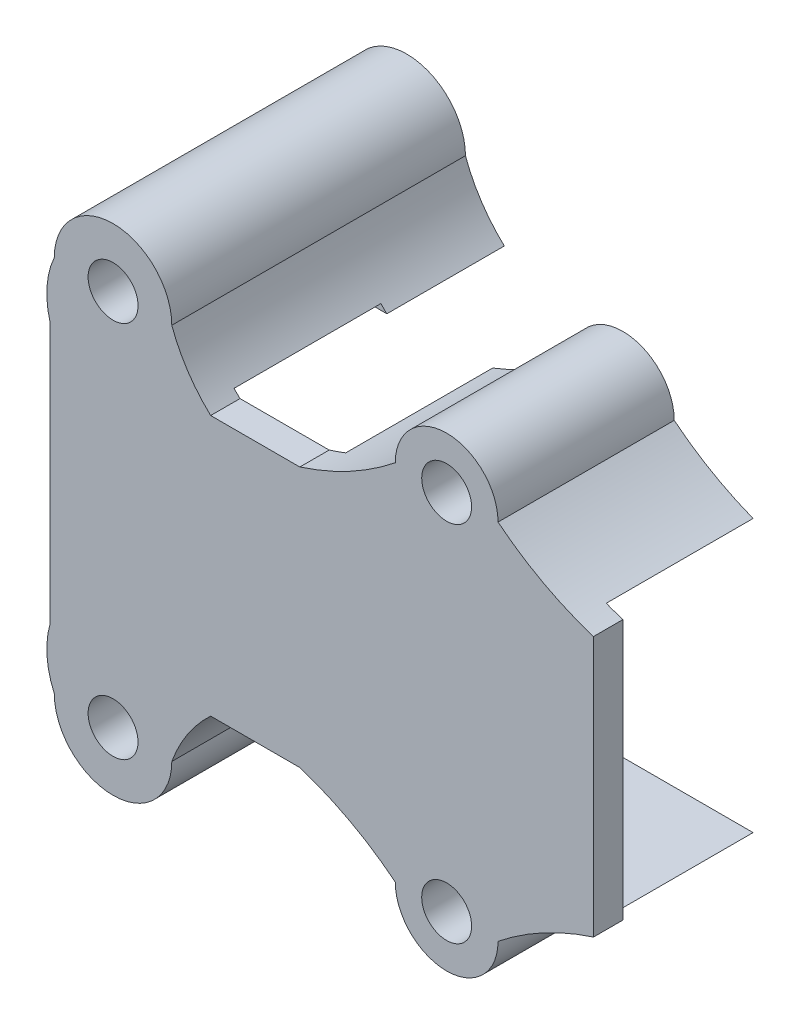
ISO-10303-21;
HEADER;
FILE_DESCRIPTION(('STEP AP214'),'2;1');
FILE_NAME('part.step','',(''),(''),'','','');
FILE_SCHEMA(('AUTOMOTIVE_DESIGN { 1 0 10303 214 1 1 1 1 }'));
ENDSEC;
DATA;
#1=APPLICATION_CONTEXT('core data for automotive mechanical design processes');
#2=APPLICATION_PROTOCOL_DEFINITION('international standard','automotive_design',2000,#1);
#3=PRODUCT_CONTEXT('',#1,'mechanical');
#4=PRODUCT('Part','Part','',(#3));
#5=PRODUCT_RELATED_PRODUCT_CATEGORY('part','',(#4));
#6=PRODUCT_DEFINITION_FORMATION('','',#4);
#7=PRODUCT_DEFINITION_CONTEXT('part definition',#1,'design');
#8=PRODUCT_DEFINITION('design','',#6,#7);
#9=PRODUCT_DEFINITION_SHAPE('','',#8);
#10=(LENGTH_UNIT() NAMED_UNIT(*) SI_UNIT(.MILLI.,.METRE.));
#11=(NAMED_UNIT(*) PLANE_ANGLE_UNIT() SI_UNIT($,.RADIAN.));
#12=(NAMED_UNIT(*) SI_UNIT($,.STERADIAN.) SOLID_ANGLE_UNIT());
#13=UNCERTAINTY_MEASURE_WITH_UNIT(LENGTH_MEASURE(1.E-05),#10,'distance_accuracy_value','');
#14=(GEOMETRIC_REPRESENTATION_CONTEXT(3) GLOBAL_UNCERTAINTY_ASSIGNED_CONTEXT((#13)) GLOBAL_UNIT_ASSIGNED_CONTEXT((#10,
#11,#12)) REPRESENTATION_CONTEXT('',''));
#15=CARTESIAN_POINT('',(0.,0.,0.));
#16=DIRECTION('',(0.,0.,1.));
#17=DIRECTION('',(1.,0.,0.));
#18=AXIS2_PLACEMENT_3D('',#15,#16,#17);
#19=CARTESIAN_POINT('',(78.7467848075669,16.0793875809967,2.));
#20=DIRECTION('',(0.,0.,-1.));
#21=DIRECTION('',(-1.,0.,0.));
#22=AXIS2_PLACEMENT_3D('',#19,#20,#21);
#23=CYLINDRICAL_SURFACE('',#22,10.1879694452596);
#24=CARTESIAN_POINT('',(78.7467848075669,16.0793875809967,0.));
#25=DIRECTION('',(0.,0.,-1.));
#26=DIRECTION('',(-1.,0.,0.));
#27=AXIS2_PLACEMENT_3D('',#24,#25,#26);
#28=CIRCLE('',#27,10.1879694452596);
#29=CARTESIAN_POINT('',(71.4070195583268,9.01379719493618,0.));
#30=VERTEX_POINT('',#29);
#31=CARTESIAN_POINT('',(71.8142757664545,8.61379719493618,0.));
#32=VERTEX_POINT('',#31);
#33=EDGE_CURVE('E460',#30,#32,#28,.F.);
#34=ORIENTED_EDGE('',*,*,#33,.F.);
#35=DIRECTION('',(0.,0.,-1.));
#36=VECTOR('',#35,1.);
#37=CARTESIAN_POINT('',(71.4070195583268,9.01379719493618,2.));
#38=LINE('',#37,#36);
#39=CARTESIAN_POINT('',(71.4070195583268,9.01379719493618,-10.));
#40=VERTEX_POINT('',#39);
#41=EDGE_CURVE('E488',#30,#40,#38,.T.);
#42=ORIENTED_EDGE('',*,*,#41,.T.);
#43=CARTESIAN_POINT('',(78.7467848075669,16.0793875809967,-10.));
#44=DIRECTION('',(0.,0.,-1.));
#45=DIRECTION('',(-1.,0.,0.));
#46=AXIS2_PLACEMENT_3D('',#43,#44,#45);
#47=CIRCLE('',#46,10.1879694452596);
#48=CARTESIAN_POINT('',(71.8142757664545,8.61379719493618,-10.));
#49=VERTEX_POINT('',#48);
#50=EDGE_CURVE('E575',#40,#49,#47,.F.);
#51=ORIENTED_EDGE('',*,*,#50,.T.);
#52=DIRECTION('',(0.,0.,1.));
#53=VECTOR('',#52,1.);
#54=CARTESIAN_POINT('',(71.8142757664545,8.61379719493618,-31.1896201004171));
#55=LINE('',#54,#53);
#56=CARTESIAN_POINT('',(71.8142757664545,8.61379719493618,-18.));
#57=VERTEX_POINT('',#56);
#58=EDGE_CURVE('E540',#57,#49,#55,.T.);
#59=ORIENTED_EDGE('',*,*,#58,.F.);
#60=CARTESIAN_POINT('',(78.7467848075669,16.0793875809967,-18.));
#61=DIRECTION('',(0.,0.,1.));
#62=DIRECTION('',(-1.,0.,0.));
#63=AXIS2_PLACEMENT_3D('',#60,#61,#62);
#64=CIRCLE('',#63,10.1879694452596);
#65=CARTESIAN_POINT('',(69.1663670351736,12.6137971949362,-18.));
#66=VERTEX_POINT('',#65);
#67=EDGE_CURVE('E520',#66,#57,#64,.T.);
#68=ORIENTED_EDGE('',*,*,#67,.F.);
#69=DIRECTION('',(0.,0.,-1.));
#70=VECTOR('',#69,1.);
#71=CARTESIAN_POINT('',(69.1663670351736,12.6137971949362,2.));
#72=LINE('',#71,#70);
#73=CARTESIAN_POINT('',(69.1663670351736,12.6137971949362,2.));
#74=VERTEX_POINT('',#73);
#75=EDGE_CURVE('E402',#74,#66,#72,.T.);
#76=ORIENTED_EDGE('',*,*,#75,.F.);
#77=CARTESIAN_POINT('',(78.7467848075669,16.0793875809967,2.));
#78=DIRECTION('',(0.,0.,-1.));
#79=DIRECTION('',(1.,0.,0.));
#80=AXIS2_PLACEMENT_3D('',#77,#78,#79);
#81=CIRCLE('',#80,10.1879694452596);
#82=CARTESIAN_POINT('',(71.8142757664545,8.61379719493618,2.));
#83=VERTEX_POINT('',#82);
#84=EDGE_CURVE('E313',#83,#74,#81,.T.);
#85=ORIENTED_EDGE('',*,*,#84,.F.);
#86=DIRECTION('',(0.,0.,-1.));
#87=VECTOR('',#86,1.);
#88=CARTESIAN_POINT('',(71.8142757664545,8.61379719493618,2.));
#89=LINE('',#88,#87);
#90=EDGE_CURVE('E405',#83,#32,#89,.T.);
#91=ORIENTED_EDGE('',*,*,#90,.T.);
#92=EDGE_LOOP('',(#34,#42,#51,#59,#68,#76,#85,#91));
#93=FACE_BOUND('',#92,.T.);
#94=ADVANCED_FACE('F39',(#93),#23,.F.);
#95=CARTESIAN_POINT('',(66.432044881579,10.2345085013512,2.));
#96=DIRECTION('',(0.,0.,-1.));
#97=DIRECTION('',(-1.,0.,0.));
#98=AXIS2_PLACEMENT_3D('',#95,#96,#97);
#99=CYLINDRICAL_SURFACE('',#98,5.77826772221092);
#100=CARTESIAN_POINT('',(66.432044881579,10.2345085013512,0.));
#101=DIRECTION('',(0.,0.,-1.));
#102=DIRECTION('',(-1.,0.,0.));
#103=AXIS2_PLACEMENT_3D('',#100,#101,#102);
#104=CIRCLE('',#103,5.77826772221092);
#105=CARTESIAN_POINT('',(60.8857242335454,8.61379719493618,0.));
#106=VERTEX_POINT('',#105);
#107=CARTESIAN_POINT('',(60.7841920350598,9.01379719493618,0.));
#108=VERTEX_POINT('',#107);
#109=EDGE_CURVE('E469',#106,#108,#104,.T.);
#110=ORIENTED_EDGE('',*,*,#109,.F.);
#111=DIRECTION('',(0.,0.,-1.));
#112=VECTOR('',#111,1.);
#113=CARTESIAN_POINT('',(60.8857242335454,8.61379719493618,2.));
#114=LINE('',#113,#112);
#115=CARTESIAN_POINT('',(60.8857242335454,8.61379719493618,2.));
#116=VERTEX_POINT('',#115);
#117=EDGE_CURVE('E395',#116,#106,#114,.T.);
#118=ORIENTED_EDGE('',*,*,#117,.F.);
#119=CARTESIAN_POINT('',(66.432044881579,10.2345085013512,2.));
#120=DIRECTION('',(0.,0.,1.));
#121=DIRECTION('',(-1.,0.,0.));
#122=AXIS2_PLACEMENT_3D('',#119,#120,#121);
#123=CIRCLE('',#122,5.77826772221092);
#124=CARTESIAN_POINT('',(61.1663670351737,12.6137971949362,2.));
#125=VERTEX_POINT('',#124);
#126=EDGE_CURVE('E319',#125,#116,#123,.T.);
#127=ORIENTED_EDGE('',*,*,#126,.F.);
#128=DIRECTION('',(0.,0.,-1.));
#129=VECTOR('',#128,1.);
#130=CARTESIAN_POINT('',(61.1663670351737,12.6137971949362,2.));
#131=LINE('',#130,#129);
#132=CARTESIAN_POINT('',(61.1663670351737,12.6137971949362,-18.));
#133=VERTEX_POINT('',#132);
#134=EDGE_CURVE('E399',#125,#133,#131,.T.);
#135=ORIENTED_EDGE('',*,*,#134,.T.);
#136=CARTESIAN_POINT('',(66.432044881579,10.2345085013512,-18.));
#137=DIRECTION('',(0.,0.,-1.));
#138=DIRECTION('',(-1.,0.,0.));
#139=AXIS2_PLACEMENT_3D('',#136,#137,#138);
#140=CIRCLE('',#139,5.77826772221092);
#141=CARTESIAN_POINT('',(60.8857242335454,8.61379719493618,-18.));
#142=VERTEX_POINT('',#141);
#143=EDGE_CURVE('E528',#142,#133,#140,.T.);
#144=ORIENTED_EDGE('',*,*,#143,.F.);
#145=DIRECTION('',(0.,0.,1.));
#146=VECTOR('',#145,1.);
#147=CARTESIAN_POINT('',(60.8857242335454,8.61379719493618,-31.1896201004171));
#148=LINE('',#147,#146);
#149=CARTESIAN_POINT('',(60.8857242335454,8.61379719493618,-10.));
#150=VERTEX_POINT('',#149);
#151=EDGE_CURVE('E536',#142,#150,#148,.T.);
#152=ORIENTED_EDGE('',*,*,#151,.T.);
#153=CARTESIAN_POINT('',(66.432044881579,10.2345085013512,-10.));
#154=DIRECTION('',(0.,0.,-1.));
#155=DIRECTION('',(-1.,0.,0.));
#156=AXIS2_PLACEMENT_3D('',#153,#154,#155);
#157=CIRCLE('',#156,5.77826772221092);
#158=CARTESIAN_POINT('',(60.7841920350598,9.01379719493618,-10.));
#159=VERTEX_POINT('',#158);
#160=EDGE_CURVE('E579',#150,#159,#157,.T.);
#161=ORIENTED_EDGE('',*,*,#160,.T.);
#162=DIRECTION('',(0.,0.,-1.));
#163=VECTOR('',#162,1.);
#164=CARTESIAN_POINT('',(60.7841920350598,9.01379719493618,2.));
#165=LINE('',#164,#163);
#166=EDGE_CURVE('E484',#159,#108,#165,.F.);
#167=ORIENTED_EDGE('',*,*,#166,.T.);
#168=EDGE_LOOP('',(#110,#118,#127,#135,#144,#152,#161,#167));
#169=FACE_BOUND('',#168,.T.);
#170=ADVANCED_FACE('F621',(#169),#99,.T.);
#171=CARTESIAN_POINT('',(66.432044881579,-10.7345085013512,2.));
#172=DIRECTION('',(0.,0.,-1.));
#173=DIRECTION('',(-1.,0.,0.));
#174=AXIS2_PLACEMENT_3D('',#171,#172,#173);
#175=CYLINDRICAL_SURFACE('',#174,5.77826772221092);
#176=CARTESIAN_POINT('',(66.432044881579,-10.7345085013512,0.));
#177=DIRECTION('',(0.,0.,-1.));
#178=DIRECTION('',(-1.,0.,0.));
#179=AXIS2_PLACEMENT_3D('',#176,#177,#178);
#180=CIRCLE('',#179,5.77826772221092);
#181=CARTESIAN_POINT('',(60.7841920350598,-9.51379719493617,0.));
#182=VERTEX_POINT('',#181);
#183=CARTESIAN_POINT('',(60.8857242335454,-9.11379719493618,0.));
#184=VERTEX_POINT('',#183);
#185=EDGE_CURVE('E466',#182,#184,#180,.T.);
#186=ORIENTED_EDGE('',*,*,#185,.F.);
#187=DIRECTION('',(0.,0.,-1.));
#188=VECTOR('',#187,1.);
#189=CARTESIAN_POINT('',(60.7841920350598,-9.51379719493617,2.));
#190=LINE('',#189,#188);
#191=CARTESIAN_POINT('',(60.7841920350598,-9.51379719493617,-10.));
#192=VERTEX_POINT('',#191);
#193=EDGE_CURVE('E480',#182,#192,#190,.T.);
#194=ORIENTED_EDGE('',*,*,#193,.T.);
#195=CARTESIAN_POINT('',(66.432044881579,-10.7345085013512,-10.));
#196=DIRECTION('',(0.,0.,-1.));
#197=DIRECTION('',(-1.,0.,0.));
#198=AXIS2_PLACEMENT_3D('',#195,#196,#197);
#199=CIRCLE('',#198,5.77826772221092);
#200=CARTESIAN_POINT('',(60.8857242335454,-9.11379719493618,-10.));
#201=VERTEX_POINT('',#200);
#202=EDGE_CURVE('E562',#192,#201,#199,.T.);
#203=ORIENTED_EDGE('',*,*,#202,.T.);
#204=DIRECTION('',(0.,0.,1.));
#205=VECTOR('',#204,1.);
#206=CARTESIAN_POINT('',(60.8857242335454,-9.11379719493618,-31.1896201004171));
#207=LINE('',#206,#205);
#208=CARTESIAN_POINT('',(60.8857242335454,-9.11379719493618,-18.));
#209=VERTEX_POINT('',#208);
#210=EDGE_CURVE('E260',#209,#201,#207,.T.);
#211=ORIENTED_EDGE('',*,*,#210,.F.);
#212=CARTESIAN_POINT('',(66.432044881579,-10.7345085013512,-18.));
#213=DIRECTION('',(0.,0.,-1.));
#214=DIRECTION('',(-1.,0.,0.));
#215=AXIS2_PLACEMENT_3D('',#212,#213,#214);
#216=CIRCLE('',#215,5.77826772221092);
#217=CARTESIAN_POINT('',(61.1663670351737,-13.1137971949362,-18.));
#218=VERTEX_POINT('',#217);
#219=EDGE_CURVE('E500',#218,#209,#216,.T.);
#220=ORIENTED_EDGE('',*,*,#219,.F.);
#221=DIRECTION('',(0.,0.,-1.));
#222=VECTOR('',#221,1.);
#223=CARTESIAN_POINT('',(61.1663670351737,-13.1137971949362,2.));
#224=LINE('',#223,#222);
#225=CARTESIAN_POINT('',(61.1663670351737,-13.1137971949362,2.));
#226=VERTEX_POINT('',#225);
#227=EDGE_CURVE('E388',#226,#218,#224,.T.);
#228=ORIENTED_EDGE('',*,*,#227,.F.);
#229=CARTESIAN_POINT('',(66.432044881579,-10.7345085013512,2.));
#230=DIRECTION('',(0.,0.,1.));
#231=DIRECTION('',(1.,0.,0.));
#232=AXIS2_PLACEMENT_3D('',#229,#230,#231);
#233=CIRCLE('',#232,5.77826772221092);
#234=CARTESIAN_POINT('',(60.8857242335454,-9.11379719493618,2.));
#235=VERTEX_POINT('',#234);
#236=EDGE_CURVE('E325',#235,#226,#233,.T.);
#237=ORIENTED_EDGE('',*,*,#236,.F.);
#238=DIRECTION('',(0.,0.,-1.));
#239=VECTOR('',#238,1.);
#240=CARTESIAN_POINT('',(60.8857242335454,-9.11379719493618,2.));
#241=LINE('',#240,#239);
#242=EDGE_CURVE('E391',#235,#184,#241,.T.);
#243=ORIENTED_EDGE('',*,*,#242,.T.);
#244=EDGE_LOOP('',(#186,#194,#203,#211,#220,#228,#237,#243));
#245=FACE_BOUND('',#244,.T.);
#246=ADVANCED_FACE('F560',(#245),#175,.T.);
#247=CARTESIAN_POINT('',(78.7467848075669,-16.5793875809967,2.));
#248=DIRECTION('',(0.,0.,-1.));
#249=DIRECTION('',(-1.,0.,0.));
#250=AXIS2_PLACEMENT_3D('',#247,#248,#249);
#251=CYLINDRICAL_SURFACE('',#250,10.1879694452596);
#252=CARTESIAN_POINT('',(78.7467848075669,-16.5793875809967,0.));
#253=DIRECTION('',(0.,0.,-1.));
#254=DIRECTION('',(-1.,0.,0.));
#255=AXIS2_PLACEMENT_3D('',#252,#253,#254);
#256=CIRCLE('',#255,10.1879694452596);
#257=CARTESIAN_POINT('',(71.8142757664545,-9.11379719493618,0.));
#258=VERTEX_POINT('',#257);
#259=CARTESIAN_POINT('',(71.4070195583268,-9.51379719493617,0.));
#260=VERTEX_POINT('',#259);
#261=EDGE_CURVE('E458',#258,#260,#256,.F.);
#262=ORIENTED_EDGE('',*,*,#261,.F.);
#263=DIRECTION('',(0.,0.,-1.));
#264=VECTOR('',#263,1.);
#265=CARTESIAN_POINT('',(71.8142757664545,-9.11379719493618,2.));
#266=LINE('',#265,#264);
#267=CARTESIAN_POINT('',(71.8142757664545,-9.11379719493618,2.));
#268=VERTEX_POINT('',#267);
#269=EDGE_CURVE('E381',#268,#258,#266,.T.);
#270=ORIENTED_EDGE('',*,*,#269,.F.);
#271=CARTESIAN_POINT('',(78.7467848075669,-16.5793875809967,2.));
#272=DIRECTION('',(0.,0.,-1.));
#273=DIRECTION('',(-1.,0.,0.));
#274=AXIS2_PLACEMENT_3D('',#271,#272,#273);
#275=CIRCLE('',#274,10.1879694452596);
#276=CARTESIAN_POINT('',(69.1663670351736,-13.1137971949362,2.));
#277=VERTEX_POINT('',#276);
#278=EDGE_CURVE('E331',#277,#268,#275,.T.);
#279=ORIENTED_EDGE('',*,*,#278,.F.);
#280=DIRECTION('',(0.,0.,-1.));
#281=VECTOR('',#280,1.);
#282=CARTESIAN_POINT('',(69.1663670351736,-13.1137971949362,2.));
#283=LINE('',#282,#281);
#284=CARTESIAN_POINT('',(69.1663670351736,-13.1137971949362,-18.));
#285=VERTEX_POINT('',#284);
#286=EDGE_CURVE('E385',#277,#285,#283,.T.);
#287=ORIENTED_EDGE('',*,*,#286,.T.);
#288=CARTESIAN_POINT('',(78.7467848075669,-16.5793875809967,-18.));
#289=DIRECTION('',(0.,0.,1.));
#290=DIRECTION('',(-1.,0.,0.));
#291=AXIS2_PLACEMENT_3D('',#288,#289,#290);
#292=CIRCLE('',#291,10.1879694452596);
#293=CARTESIAN_POINT('',(71.8142757664545,-9.11379719493618,-18.));
#294=VERTEX_POINT('',#293);
#295=EDGE_CURVE('E508',#294,#285,#292,.T.);
#296=ORIENTED_EDGE('',*,*,#295,.F.);
#297=DIRECTION('',(0.,0.,1.));
#298=VECTOR('',#297,1.);
#299=CARTESIAN_POINT('',(71.8142757664545,-9.11379719493618,-31.1896201004171));
#300=LINE('',#299,#298);
#301=CARTESIAN_POINT('',(71.8142757664545,-9.11379719493618,-10.));
#302=VERTEX_POINT('',#301);
#303=EDGE_CURVE('E543',#294,#302,#300,.T.);
#304=ORIENTED_EDGE('',*,*,#303,.T.);
#305=CARTESIAN_POINT('',(78.7467848075669,-16.5793875809967,-10.));
#306=DIRECTION('',(0.,0.,-1.));
#307=DIRECTION('',(-1.,0.,0.));
#308=AXIS2_PLACEMENT_3D('',#305,#306,#307);
#309=CIRCLE('',#308,10.1879694452596);
#310=CARTESIAN_POINT('',(71.4070195583268,-9.51379719493617,-10.));
#311=VERTEX_POINT('',#310);
#312=EDGE_CURVE('E567',#302,#311,#309,.F.);
#313=ORIENTED_EDGE('',*,*,#312,.T.);
#314=DIRECTION('',(0.,0.,-1.));
#315=VECTOR('',#314,1.);
#316=CARTESIAN_POINT('',(71.4070195583268,-9.51379719493617,2.));
#317=LINE('',#316,#315);
#318=EDGE_CURVE('E246',#311,#260,#317,.F.);
#319=ORIENTED_EDGE('',*,*,#318,.T.);
#320=EDGE_LOOP('',(#262,#270,#279,#287,#296,#304,#313,#319));
#321=FACE_BOUND('',#320,.T.);
#322=ADVANCED_FACE('F634',(#321),#251,.F.);
#323=CARTESIAN_POINT('',(104.095788097164,27.9324872273707,0.));
#324=DIRECTION('',(0.,0.,1.));
#325=DIRECTION('',(1.,0.,0.));
#326=AXIS2_PLACEMENT_3D('',#323,#324,#325);
#327=PLANE('',#326);
#328=DIRECTION('',(0.,-1.,0.));
#329=VECTOR('',#328,1.);
#330=CARTESIAN_POINT('',(60.8857242335454,8.61379719493618,0.));
#331=LINE('',#330,#329);
#332=EDGE_CURVE('E353',#106,#184,#331,.T.);
#333=ORIENTED_EDGE('',*,*,#332,.F.);
#334=ORIENTED_EDGE('',*,*,#109,.T.);
#335=DIRECTION('',(1.,0.,0.));
#336=VECTOR('',#335,1.);
#337=CARTESIAN_POINT('',(97.8857242335454,9.01379719493618,0.));
#338=LINE('',#337,#336);
#339=EDGE_CURVE('E583',#108,#30,#338,.T.);
#340=ORIENTED_EDGE('',*,*,#339,.T.);
#341=ORIENTED_EDGE('',*,*,#33,.T.);
#342=DIRECTION('',(-1.,0.,0.));
#343=VECTOR('',#342,1.);
#344=CARTESIAN_POINT('',(77.8857242335454,8.61379719493619,0.));
#345=LINE('',#344,#343);
#346=CARTESIAN_POINT('',(77.8857242335454,8.61379719493618,0.));
#347=VERTEX_POINT('',#346);
#348=EDGE_CURVE('E298',#347,#32,#345,.T.);
#349=ORIENTED_EDGE('',*,*,#348,.F.);
#350=CARTESIAN_POINT('',(71.6756603699269,27.9324872273707,0.));
#351=DIRECTION('',(0.,0.,-1.));
#352=DIRECTION('',(-1.,0.,0.));
#353=AXIS2_PLACEMENT_3D('',#350,#351,#352);
#354=CIRCLE('',#353,20.2922812359652);
#355=CARTESIAN_POINT('',(79.0145870772982,9.01379719493618,0.));
#356=VERTEX_POINT('',#355);
#357=EDGE_CURVE('E472',#347,#356,#354,.F.);
#358=ORIENTED_EDGE('',*,*,#357,.T.);
#359=CARTESIAN_POINT('',(96.7568613897926,9.01379719493618,0.));
#360=VERTEX_POINT('',#359);
#361=EDGE_CURVE('E453',#356,#360,#338,.T.);
#362=ORIENTED_EDGE('',*,*,#361,.T.);
#363=CARTESIAN_POINT('',(104.095788097164,27.9324872273707,0.));
#364=DIRECTION('',(0.,0.,-1.));
#365=DIRECTION('',(-1.,0.,0.));
#366=AXIS2_PLACEMENT_3D('',#363,#364,#365);
#367=CIRCLE('',#366,20.2922812359652);
#368=CARTESIAN_POINT('',(97.8857242335454,8.61379719493619,0.));
#369=VERTEX_POINT('',#368);
#370=EDGE_CURVE('E443',#360,#369,#367,.F.);
#371=ORIENTED_EDGE('',*,*,#370,.T.);
#372=DIRECTION('',(0.,1.,0.));
#373=VECTOR('',#372,1.);
#374=CARTESIAN_POINT('',(97.8857242335454,8.61379719493618,0.));
#375=LINE('',#374,#373);
#376=CARTESIAN_POINT('',(97.8857242335454,-9.11379719493618,0.));
#377=VERTEX_POINT('',#376);
#378=EDGE_CURVE('E304',#377,#369,#375,.T.);
#379=ORIENTED_EDGE('',*,*,#378,.F.);
#380=CARTESIAN_POINT('',(104.095788097164,-28.4324872273707,0.));
#381=DIRECTION('',(0.,0.,-1.));
#382=DIRECTION('',(-1.,0.,0.));
#383=AXIS2_PLACEMENT_3D('',#380,#381,#382);
#384=CIRCLE('',#383,20.2922812359652);
#385=CARTESIAN_POINT('',(96.7568613897926,-9.51379719493618,0.));
#386=VERTEX_POINT('',#385);
#387=EDGE_CURVE('E451',#377,#386,#384,.F.);
#388=ORIENTED_EDGE('',*,*,#387,.T.);
#389=DIRECTION('',(-1.,0.,0.));
#390=VECTOR('',#389,1.);
#391=CARTESIAN_POINT('',(97.8857242335454,-9.51379719493617,0.));
#392=LINE('',#391,#390);
#393=CARTESIAN_POINT('',(79.0145870772982,-9.51379719493618,0.));
#394=VERTEX_POINT('',#393);
#395=EDGE_CURVE('E590',#386,#394,#392,.T.);
#396=ORIENTED_EDGE('',*,*,#395,.T.);
#397=CARTESIAN_POINT('',(71.6756603699269,-28.4324872273707,0.));
#398=DIRECTION('',(0.,0.,-1.));
#399=DIRECTION('',(-1.,0.,0.));
#400=AXIS2_PLACEMENT_3D('',#397,#398,#399);
#401=CIRCLE('',#400,20.2922812359652);
#402=CARTESIAN_POINT('',(77.8857242335454,-9.11379719493618,0.));
#403=VERTEX_POINT('',#402);
#404=EDGE_CURVE('E244',#394,#403,#401,.F.);
#405=ORIENTED_EDGE('',*,*,#404,.T.);
#406=DIRECTION('',(1.,0.,0.));
#407=VECTOR('',#406,1.);
#408=CARTESIAN_POINT('',(77.8857242335454,-9.11379719493618,0.));
#409=LINE('',#408,#407);
#410=EDGE_CURVE('E357',#258,#403,#409,.T.);
#411=ORIENTED_EDGE('',*,*,#410,.F.);
#412=ORIENTED_EDGE('',*,*,#261,.T.);
#413=EDGE_CURVE('E591',#260,#182,#392,.T.);
#414=ORIENTED_EDGE('',*,*,#413,.T.);
#415=ORIENTED_EDGE('',*,*,#185,.T.);
#416=EDGE_LOOP('',(#333,#334,#340,#341,#349,#358,#362,#371,#379,#388,#396,#405,#411,#412,#414,#415));
#417=FACE_BOUND('',#416,.T.);
#418=ADVANCED_FACE('F450',(#417),#327,.F.);
#419=CARTESIAN_POINT('',(104.095788097164,27.9324872273707,2.));
#420=DIRECTION('',(0.,0.,1.));
#421=DIRECTION('',(1.,0.,0.));
#422=AXIS2_PLACEMENT_3D('',#419,#420,#421);
#423=PLANE('',#422);
#424=CARTESIAN_POINT('',(65.1663670351737,12.6137971949362,2.));
#425=DIRECTION('',(0.,0.,1.));
#426=DIRECTION('',(1.,0.,0.));
#427=AXIS2_PLACEMENT_3D('',#424,#425,#426);
#428=CIRCLE('',#427,1.7);
#429=CARTESIAN_POINT('',(66.8663670351737,12.6137971949362,2.));
#430=VERTEX_POINT('',#429);
#431=EDGE_CURVE('E286',#430,#430,#428,.T.);
#432=ORIENTED_EDGE('',*,*,#431,.F.);
#433=EDGE_LOOP('',(#432));
#434=FACE_BOUND('',#433,.T.);
#435=CARTESIAN_POINT('',(87.8857242335454,12.1137971949362,2.));
#436=DIRECTION('',(0.,0.,1.));
#437=DIRECTION('',(1.,0.,0.));
#438=AXIS2_PLACEMENT_3D('',#435,#436,#437);
#439=CIRCLE('',#438,1.7);
#440=CARTESIAN_POINT('',(89.5857242335454,12.1137971949362,2.));
#441=VERTEX_POINT('',#440);
#442=EDGE_CURVE('E294',#441,#441,#439,.T.);
#443=ORIENTED_EDGE('',*,*,#442,.F.);
#444=EDGE_LOOP('',(#443));
#445=FACE_BOUND('',#444,.T.);
#446=CARTESIAN_POINT('',(104.095788097164,27.9324872273707,2.));
#447=DIRECTION('',(0.,0.,-1.));
#448=DIRECTION('',(1.,0.,0.));
#449=AXIS2_PLACEMENT_3D('',#446,#447,#448);
#450=CIRCLE('',#449,20.2922812359652);
#451=CARTESIAN_POINT('',(97.8857242335454,8.61379719493618,2.));
#452=VERTEX_POINT('',#451);
#453=CARTESIAN_POINT('',(91.3857242335454,12.1137971949362,2.));
#454=VERTEX_POINT('',#453);
#455=EDGE_CURVE('E299',#452,#454,#450,.T.);
#456=ORIENTED_EDGE('',*,*,#455,.T.);
#457=CARTESIAN_POINT('',(87.8857242335454,12.1137971949362,2.));
#458=DIRECTION('',(0.,0.,1.));
#459=DIRECTION('',(1.,0.,0.));
#460=AXIS2_PLACEMENT_3D('',#457,#458,#459);
#461=CIRCLE('',#460,3.5);
#462=CARTESIAN_POINT('',(84.3857242335454,12.1137971949362,2.));
#463=VERTEX_POINT('',#462);
#464=EDGE_CURVE('E303',#454,#463,#461,.T.);
#465=ORIENTED_EDGE('',*,*,#464,.T.);
#466=CARTESIAN_POINT('',(71.6756603699269,27.9324872273707,2.));
#467=DIRECTION('',(0.,0.,-1.));
#468=DIRECTION('',(1.,0.,0.));
#469=AXIS2_PLACEMENT_3D('',#466,#467,#468);
#470=CIRCLE('',#469,20.2922812359652);
#471=CARTESIAN_POINT('',(77.8857242335454,8.61379719493619,2.));
#472=VERTEX_POINT('',#471);
#473=EDGE_CURVE('E307',#463,#472,#470,.T.);
#474=ORIENTED_EDGE('',*,*,#473,.T.);
#475=DIRECTION('',(-1.,0.,0.));
#476=VECTOR('',#475,1.);
#477=CARTESIAN_POINT('',(77.8857242335454,8.61379719493619,2.));
#478=LINE('',#477,#476);
#479=EDGE_CURVE('E310',#472,#83,#478,.T.);
#480=ORIENTED_EDGE('',*,*,#479,.T.);
#481=ORIENTED_EDGE('',*,*,#84,.T.);
#482=CARTESIAN_POINT('',(65.1663670351737,12.6137971949362,2.));
#483=DIRECTION('',(0.,0.,1.));
#484=DIRECTION('',(1.,0.,0.));
#485=AXIS2_PLACEMENT_3D('',#482,#483,#484);
#486=CIRCLE('',#485,3.99999999999999);
#487=EDGE_CURVE('E316',#74,#125,#486,.T.);
#488=ORIENTED_EDGE('',*,*,#487,.T.);
#489=ORIENTED_EDGE('',*,*,#126,.T.);
#490=DIRECTION('',(0.,-1.,0.));
#491=VECTOR('',#490,1.);
#492=CARTESIAN_POINT('',(60.8857242335454,8.61379719493618,2.));
#493=LINE('',#492,#491);
#494=EDGE_CURVE('E322',#116,#235,#493,.T.);
#495=ORIENTED_EDGE('',*,*,#494,.T.);
#496=ORIENTED_EDGE('',*,*,#236,.T.);
#497=CARTESIAN_POINT('',(65.1663670351737,-13.1137971949362,2.));
#498=DIRECTION('',(0.,0.,1.));
#499=DIRECTION('',(1.,0.,0.));
#500=AXIS2_PLACEMENT_3D('',#497,#498,#499);
#501=CIRCLE('',#500,3.99999999999999);
#502=EDGE_CURVE('E328',#226,#277,#501,.T.);
#503=ORIENTED_EDGE('',*,*,#502,.T.);
#504=ORIENTED_EDGE('',*,*,#278,.T.);
#505=DIRECTION('',(1.,0.,0.));
#506=VECTOR('',#505,1.);
#507=CARTESIAN_POINT('',(77.8857242335454,-9.11379719493618,2.));
#508=LINE('',#507,#506);
#509=CARTESIAN_POINT('',(77.8857242335454,-9.11379719493618,2.));
#510=VERTEX_POINT('',#509);
#511=EDGE_CURVE('E334',#268,#510,#508,.T.);
#512=ORIENTED_EDGE('',*,*,#511,.T.);
#513=CARTESIAN_POINT('',(71.6756603699269,-28.4324872273707,2.));
#514=DIRECTION('',(0.,0.,-1.));
#515=DIRECTION('',(1.,0.,0.));
#516=AXIS2_PLACEMENT_3D('',#513,#514,#515);
#517=CIRCLE('',#516,20.2922812359652);
#518=CARTESIAN_POINT('',(84.3857242335454,-12.6137971949362,2.));
#519=VERTEX_POINT('',#518);
#520=EDGE_CURVE('E337',#510,#519,#517,.T.);
#521=ORIENTED_EDGE('',*,*,#520,.T.);
#522=CARTESIAN_POINT('',(87.8857242335454,-12.6137971949362,2.));
#523=DIRECTION('',(0.,0.,1.));
#524=DIRECTION('',(1.,0.,0.));
#525=AXIS2_PLACEMENT_3D('',#522,#523,#524);
#526=CIRCLE('',#525,3.5);
#527=CARTESIAN_POINT('',(91.3857242335454,-12.6137971949362,2.));
#528=VERTEX_POINT('',#527);
#529=EDGE_CURVE('E340',#519,#528,#526,.T.);
#530=ORIENTED_EDGE('',*,*,#529,.T.);
#531=CARTESIAN_POINT('',(104.095788097164,-28.4324872273707,2.));
#532=DIRECTION('',(0.,0.,-1.));
#533=DIRECTION('',(1.,0.,0.));
#534=AXIS2_PLACEMENT_3D('',#531,#532,#533);
#535=CIRCLE('',#534,20.2922812359652);
#536=CARTESIAN_POINT('',(97.8857242335454,-9.11379719493618,2.));
#537=VERTEX_POINT('',#536);
#538=EDGE_CURVE('E343',#528,#537,#535,.T.);
#539=ORIENTED_EDGE('',*,*,#538,.T.);
#540=DIRECTION('',(0.,1.,0.));
#541=VECTOR('',#540,1.);
#542=CARTESIAN_POINT('',(97.8857242335454,8.61379719493618,2.));
#543=LINE('',#542,#541);
#544=EDGE_CURVE('E346',#537,#452,#543,.T.);
#545=ORIENTED_EDGE('',*,*,#544,.T.);
#546=EDGE_LOOP('',(#456,#465,#474,#480,#481,#488,#489,#495,#496,#503,#504,#512,#521,#530,#539,#545));
#547=FACE_BOUND('',#546,.T.);
#548=CARTESIAN_POINT('',(65.1663670351737,-13.1137971949362,2.));
#549=DIRECTION('',(0.,0.,1.));
#550=DIRECTION('',(1.,0.,0.));
#551=AXIS2_PLACEMENT_3D('',#548,#549,#550);
#552=CIRCLE('',#551,1.7);
#553=CARTESIAN_POINT('',(66.8663670351737,-13.1137971949362,2.));
#554=VERTEX_POINT('',#553);
#555=EDGE_CURVE('E290',#554,#554,#552,.T.);
#556=ORIENTED_EDGE('',*,*,#555,.F.);
#557=EDGE_LOOP('',(#556));
#558=FACE_BOUND('',#557,.T.);
#559=CARTESIAN_POINT('',(87.8857242335454,-12.6137971949362,2.));
#560=DIRECTION('',(0.,0.,1.));
#561=DIRECTION('',(1.,0.,0.));
#562=AXIS2_PLACEMENT_3D('',#559,#560,#561);
#563=CIRCLE('',#562,1.7);
#564=CARTESIAN_POINT('',(89.5857242335454,-12.6137971949362,2.));
#565=VERTEX_POINT('',#564);
#566=EDGE_CURVE('E279',#565,#565,#563,.T.);
#567=ORIENTED_EDGE('',*,*,#566,.F.);
#568=EDGE_LOOP('',(#567));
#569=FACE_BOUND('',#568,.T.);
#570=ADVANCED_FACE('F438',(#434,#445,#547,#558,#569),#423,.T.);
#571=CARTESIAN_POINT('',(104.095788097164,27.9324872273707,2.));
#572=DIRECTION('',(0.,0.,-1.));
#573=DIRECTION('',(-1.,0.,0.));
#574=AXIS2_PLACEMENT_3D('',#571,#572,#573);
#575=CYLINDRICAL_SURFACE('',#574,20.2922812359652);
#576=ORIENTED_EDGE('',*,*,#370,.F.);
#577=DIRECTION('',(0.,0.,-1.));
#578=VECTOR('',#577,1.);
#579=CARTESIAN_POINT('',(96.7568613897926,9.01379719493618,2.));
#580=LINE('',#579,#578);
#581=CARTESIAN_POINT('',(96.7568613897926,9.01379719493618,-10.));
#582=VERTEX_POINT('',#581);
#583=EDGE_CURVE('E427',#360,#582,#580,.T.);
#584=ORIENTED_EDGE('',*,*,#583,.T.);
#585=CARTESIAN_POINT('',(104.095788097164,27.9324872273707,-10.));
#586=DIRECTION('',(0.,0.,-1.));
#587=DIRECTION('',(-1.,0.,0.));
#588=AXIS2_PLACEMENT_3D('',#585,#586,#587);
#589=CIRCLE('',#588,20.2922812359652);
#590=CARTESIAN_POINT('',(91.3857242335454,12.1137971949362,-10.));
#591=VERTEX_POINT('',#590);
#592=EDGE_CURVE('E275',#591,#582,#589,.F.);
#593=ORIENTED_EDGE('',*,*,#592,.F.);
#594=DIRECTION('',(0.,0.,-1.));
#595=VECTOR('',#594,1.);
#596=CARTESIAN_POINT('',(91.3857242335454,12.1137971949362,2.));
#597=LINE('',#596,#595);
#598=EDGE_CURVE('E48',#454,#591,#597,.T.);
#599=ORIENTED_EDGE('',*,*,#598,.F.);
#600=ORIENTED_EDGE('',*,*,#455,.F.);
#601=DIRECTION('',(0.,0.,-1.));
#602=VECTOR('',#601,1.);
#603=CARTESIAN_POINT('',(97.8857242335454,8.61379719493618,2.));
#604=LINE('',#603,#602);
#605=EDGE_CURVE('E349',#452,#369,#604,.T.);
#606=ORIENTED_EDGE('',*,*,#605,.T.);
#607=EDGE_LOOP('',(#576,#584,#593,#599,#600,#606));
#608=FACE_BOUND('',#607,.T.);
#609=ADVANCED_FACE('F41',(#608),#575,.F.);
#610=CARTESIAN_POINT('',(87.8857242335454,12.1137971949362,2.));
#611=DIRECTION('',(0.,0.,-1.));
#612=DIRECTION('',(-1.,0.,0.));
#613=AXIS2_PLACEMENT_3D('',#610,#611,#612);
#614=CYLINDRICAL_SURFACE('',#613,3.5);
#615=ORIENTED_EDGE('',*,*,#598,.T.);
#616=CARTESIAN_POINT('',(87.8857242335454,12.1137971949362,-10.));
#617=DIRECTION('',(0.,0.,-1.));
#618=DIRECTION('',(-1.,0.,0.));
#619=AXIS2_PLACEMENT_3D('',#616,#617,#618);
#620=CIRCLE('',#619,3.5);
#621=CARTESIAN_POINT('',(84.3857242335454,12.1137971949362,-10.));
#622=VERTEX_POINT('',#621);
#623=EDGE_CURVE('E268',#622,#591,#620,.T.);
#624=ORIENTED_EDGE('',*,*,#623,.F.);
#625=DIRECTION('',(0.,0.,-1.));
#626=VECTOR('',#625,1.);
#627=CARTESIAN_POINT('',(84.3857242335454,12.1137971949362,2.));
#628=LINE('',#627,#626);
#629=EDGE_CURVE('E413',#463,#622,#628,.T.);
#630=ORIENTED_EDGE('',*,*,#629,.F.);
#631=ORIENTED_EDGE('',*,*,#464,.F.);
#632=EDGE_LOOP('',(#615,#624,#630,#631));
#633=FACE_BOUND('',#632,.T.);
#634=ADVANCED_FACE('F421',(#633),#614,.T.);
#635=CARTESIAN_POINT('',(71.6756603699269,27.9324872273707,2.));
#636=DIRECTION('',(0.,0.,-1.));
#637=DIRECTION('',(-1.,0.,0.));
#638=AXIS2_PLACEMENT_3D('',#635,#636,#637);
#639=CYLINDRICAL_SURFACE('',#638,20.2922812359652);
#640=CARTESIAN_POINT('',(71.6756603699269,27.9324872273707,-10.));
#641=DIRECTION('',(0.,0.,-1.));
#642=DIRECTION('',(-1.,0.,0.));
#643=AXIS2_PLACEMENT_3D('',#640,#641,#642);
#644=CIRCLE('',#643,20.2922812359652);
#645=CARTESIAN_POINT('',(79.0145870772982,9.01379719493618,-10.));
#646=VERTEX_POINT('',#645);
#647=EDGE_CURVE('E272',#646,#622,#644,.F.);
#648=ORIENTED_EDGE('',*,*,#647,.F.);
#649=DIRECTION('',(0.,0.,-1.));
#650=VECTOR('',#649,1.);
#651=CARTESIAN_POINT('',(79.0145870772982,9.01379719493618,2.));
#652=LINE('',#651,#650);
#653=EDGE_CURVE('E55',#646,#356,#652,.F.);
#654=ORIENTED_EDGE('',*,*,#653,.T.);
#655=ORIENTED_EDGE('',*,*,#357,.F.);
#656=DIRECTION('',(0.,0.,-1.));
#657=VECTOR('',#656,1.);
#658=CARTESIAN_POINT('',(77.8857242335454,8.61379719493619,2.));
#659=LINE('',#658,#657);
#660=EDGE_CURVE('E409',#472,#347,#659,.T.);
#661=ORIENTED_EDGE('',*,*,#660,.F.);
#662=ORIENTED_EDGE('',*,*,#473,.F.);
#663=ORIENTED_EDGE('',*,*,#629,.T.);
#664=EDGE_LOOP('',(#648,#654,#655,#661,#662,#663));
#665=FACE_BOUND('',#664,.T.);
#666=ADVANCED_FACE('F434',(#665),#639,.F.);
#667=CARTESIAN_POINT('',(77.8857242335454,8.61379719493619,2.));
#668=DIRECTION('',(0.,-1.,0.));
#669=DIRECTION('',(1.,0.,0.));
#670=AXIS2_PLACEMENT_3D('',#667,#668,#669);
#671=PLANE('',#670);
#672=ORIENTED_EDGE('',*,*,#348,.T.);
#673=ORIENTED_EDGE('',*,*,#90,.F.);
#674=ORIENTED_EDGE('',*,*,#479,.F.);
#675=ORIENTED_EDGE('',*,*,#660,.T.);
#676=EDGE_LOOP('',(#672,#673,#674,#675));
#677=FACE_BOUND('',#676,.T.);
#678=ADVANCED_FACE('F609',(#677),#671,.F.);
#679=CARTESIAN_POINT('',(65.1663670351737,12.6137971949362,2.));
#680=DIRECTION('',(0.,0.,-1.));
#681=DIRECTION('',(-1.,0.,0.));
#682=AXIS2_PLACEMENT_3D('',#679,#680,#681);
#683=CYLINDRICAL_SURFACE('',#682,3.99999999999999);
#684=ORIENTED_EDGE('',*,*,#75,.T.);
#685=CARTESIAN_POINT('',(65.1663670351737,12.6137971949362,-18.));
#686=DIRECTION('',(0.,0.,-1.));
#687=DIRECTION('',(-1.,0.,0.));
#688=AXIS2_PLACEMENT_3D('',#685,#686,#687);
#689=CIRCLE('',#688,3.99999999999999);
#690=EDGE_CURVE('E532',#133,#66,#689,.T.);
#691=ORIENTED_EDGE('',*,*,#690,.F.);
#692=ORIENTED_EDGE('',*,*,#134,.F.);
#693=ORIENTED_EDGE('',*,*,#487,.F.);
#694=EDGE_LOOP('',(#684,#691,#692,#693));
#695=FACE_BOUND('',#694,.T.);
#696=ADVANCED_FACE('F618',(#695),#683,.T.);
#697=CARTESIAN_POINT('',(60.8857242335454,8.61379719493618,2.));
#698=DIRECTION('',(1.,0.,0.));
#699=DIRECTION('',(0.,0.,-1.));
#700=AXIS2_PLACEMENT_3D('',#697,#698,#699);
#701=PLANE('',#700);
#702=ORIENTED_EDGE('',*,*,#332,.T.);
#703=ORIENTED_EDGE('',*,*,#242,.F.);
#704=ORIENTED_EDGE('',*,*,#494,.F.);
#705=ORIENTED_EDGE('',*,*,#117,.T.);
#706=EDGE_LOOP('',(#702,#703,#704,#705));
#707=FACE_BOUND('',#706,.T.);
#708=ADVANCED_FACE('F625',(#707),#701,.F.);
#709=CARTESIAN_POINT('',(65.1663670351737,-13.1137971949362,2.));
#710=DIRECTION('',(0.,0.,-1.));
#711=DIRECTION('',(-1.,0.,0.));
#712=AXIS2_PLACEMENT_3D('',#709,#710,#711);
#713=CYLINDRICAL_SURFACE('',#712,3.99999999999999);
#714=ORIENTED_EDGE('',*,*,#227,.T.);
#715=CARTESIAN_POINT('',(65.1663670351737,-13.1137971949362,-18.));
#716=DIRECTION('',(0.,0.,-1.));
#717=DIRECTION('',(-1.,0.,0.));
#718=AXIS2_PLACEMENT_3D('',#715,#716,#717);
#719=CIRCLE('',#718,3.99999999999999);
#720=EDGE_CURVE('E512',#285,#218,#719,.T.);
#721=ORIENTED_EDGE('',*,*,#720,.F.);
#722=ORIENTED_EDGE('',*,*,#286,.F.);
#723=ORIENTED_EDGE('',*,*,#502,.F.);
#724=EDGE_LOOP('',(#714,#721,#722,#723));
#725=FACE_BOUND('',#724,.T.);
#726=ADVANCED_FACE('F631',(#725),#713,.T.);
#727=CARTESIAN_POINT('',(77.8857242335454,-9.11379719493618,2.));
#728=DIRECTION('',(0.,1.,0.));
#729=DIRECTION('',(-1.,0.,0.));
#730=AXIS2_PLACEMENT_3D('',#727,#728,#729);
#731=PLANE('',#730);
#732=ORIENTED_EDGE('',*,*,#410,.T.);
#733=DIRECTION('',(0.,0.,-1.));
#734=VECTOR('',#733,1.);
#735=CARTESIAN_POINT('',(77.8857242335454,-9.11379719493618,2.));
#736=LINE('',#735,#734);
#737=EDGE_CURVE('E378',#510,#403,#736,.T.);
#738=ORIENTED_EDGE('',*,*,#737,.F.);
#739=ORIENTED_EDGE('',*,*,#511,.F.);
#740=ORIENTED_EDGE('',*,*,#269,.T.);
#741=EDGE_LOOP('',(#732,#738,#739,#740));
#742=FACE_BOUND('',#741,.T.);
#743=ADVANCED_FACE('F639',(#742),#731,.F.);
#744=CARTESIAN_POINT('',(71.6756603699269,-28.4324872273707,2.));
#745=DIRECTION('',(0.,0.,-1.));
#746=DIRECTION('',(-1.,0.,0.));
#747=AXIS2_PLACEMENT_3D('',#744,#745,#746);
#748=CYLINDRICAL_SURFACE('',#747,20.2922812359652);
#749=ORIENTED_EDGE('',*,*,#404,.F.);
#750=DIRECTION('',(0.,0.,-1.));
#751=VECTOR('',#750,1.);
#752=CARTESIAN_POINT('',(79.0145870772982,-9.51379719493618,2.));
#753=LINE('',#752,#751);
#754=CARTESIAN_POINT('',(79.0145870772982,-9.51379719493617,-10.));
#755=VERTEX_POINT('',#754);
#756=EDGE_CURVE('E227',#394,#755,#753,.T.);
#757=ORIENTED_EDGE('',*,*,#756,.T.);
#758=CARTESIAN_POINT('',(71.6756603699269,-28.4324872273707,-10.));
#759=DIRECTION('',(0.,0.,-1.));
#760=DIRECTION('',(-1.,0.,0.));
#761=AXIS2_PLACEMENT_3D('',#758,#759,#760);
#762=CIRCLE('',#761,20.2922812359652);
#763=CARTESIAN_POINT('',(84.3857242335454,-12.6137971949362,-10.));
#764=VERTEX_POINT('',#763);
#765=EDGE_CURVE('E241',#764,#755,#762,.F.);
#766=ORIENTED_EDGE('',*,*,#765,.F.);
#767=DIRECTION('',(0.,0.,-1.));
#768=VECTOR('',#767,1.);
#769=CARTESIAN_POINT('',(84.3857242335454,-12.6137971949362,2.));
#770=LINE('',#769,#768);
#771=EDGE_CURVE('E375',#519,#764,#770,.T.);
#772=ORIENTED_EDGE('',*,*,#771,.F.);
#773=ORIENTED_EDGE('',*,*,#520,.F.);
#774=ORIENTED_EDGE('',*,*,#737,.T.);
#775=EDGE_LOOP('',(#749,#757,#766,#772,#773,#774));
#776=FACE_BOUND('',#775,.T.);
#777=ADVANCED_FACE('F239',(#776),#748,.F.);
#778=CARTESIAN_POINT('',(87.8857242335454,-12.6137971949362,2.));
#779=DIRECTION('',(0.,0.,-1.));
#780=DIRECTION('',(-1.,0.,0.));
#781=AXIS2_PLACEMENT_3D('',#778,#779,#780);
#782=CYLINDRICAL_SURFACE('',#781,3.5);
#783=ORIENTED_EDGE('',*,*,#771,.T.);
#784=CARTESIAN_POINT('',(87.8857242335454,-12.6137971949362,-10.));
#785=DIRECTION('',(0.,0.,-1.));
#786=DIRECTION('',(-1.,0.,0.));
#787=AXIS2_PLACEMENT_3D('',#784,#785,#786);
#788=CIRCLE('',#787,3.5);
#789=CARTESIAN_POINT('',(91.3857242335454,-12.6137971949362,-10.));
#790=VERTEX_POINT('',#789);
#791=EDGE_CURVE('E251',#790,#764,#788,.T.);
#792=ORIENTED_EDGE('',*,*,#791,.F.);
#793=DIRECTION('',(0.,0.,-1.));
#794=VECTOR('',#793,1.);
#795=CARTESIAN_POINT('',(91.3857242335454,-12.6137971949362,2.));
#796=LINE('',#795,#794);
#797=EDGE_CURVE('E371',#528,#790,#796,.T.);
#798=ORIENTED_EDGE('',*,*,#797,.F.);
#799=ORIENTED_EDGE('',*,*,#529,.F.);
#800=EDGE_LOOP('',(#783,#792,#798,#799));
#801=FACE_BOUND('',#800,.T.);
#802=ADVANCED_FACE('F644',(#801),#782,.T.);
#803=CARTESIAN_POINT('',(104.095788097164,-28.4324872273707,2.));
#804=DIRECTION('',(0.,0.,-1.));
#805=DIRECTION('',(-1.,0.,0.));
#806=AXIS2_PLACEMENT_3D('',#803,#804,#805);
#807=CYLINDRICAL_SURFACE('',#806,20.2922812359652);
#808=CARTESIAN_POINT('',(104.095788097164,-28.4324872273707,-10.));
#809=DIRECTION('',(0.,0.,-1.));
#810=DIRECTION('',(-1.,0.,0.));
#811=AXIS2_PLACEMENT_3D('',#808,#809,#810);
#812=CIRCLE('',#811,20.2922812359652);
#813=CARTESIAN_POINT('',(96.7568613897926,-9.51379719493618,-10.));
#814=VERTEX_POINT('',#813);
#815=EDGE_CURVE('E257',#814,#790,#812,.F.);
#816=ORIENTED_EDGE('',*,*,#815,.F.);
#817=DIRECTION('',(0.,0.,-1.));
#818=VECTOR('',#817,1.);
#819=CARTESIAN_POINT('',(96.7568613897926,-9.51379719493618,2.));
#820=LINE('',#819,#818);
#821=EDGE_CURVE('E63',#814,#386,#820,.F.);
#822=ORIENTED_EDGE('',*,*,#821,.T.);
#823=ORIENTED_EDGE('',*,*,#387,.F.);
#824=DIRECTION('',(0.,0.,-1.));
#825=VECTOR('',#824,1.);
#826=CARTESIAN_POINT('',(97.8857242335454,-9.11379719493618,2.));
#827=LINE('',#826,#825);
#828=EDGE_CURVE('E367',#537,#377,#827,.T.);
#829=ORIENTED_EDGE('',*,*,#828,.F.);
#830=ORIENTED_EDGE('',*,*,#538,.F.);
#831=ORIENTED_EDGE('',*,*,#797,.T.);
#832=EDGE_LOOP('',(#816,#822,#823,#829,#830,#831));
#833=FACE_BOUND('',#832,.T.);
#834=ADVANCED_FACE('F647',(#833),#807,.F.);
#835=CARTESIAN_POINT('',(97.8857242335454,8.61379719493618,2.));
#836=DIRECTION('',(-1.,0.,0.));
#837=DIRECTION('',(0.,0.,1.));
#838=AXIS2_PLACEMENT_3D('',#835,#836,#837);
#839=PLANE('',#838);
#840=ORIENTED_EDGE('',*,*,#378,.T.);
#841=ORIENTED_EDGE('',*,*,#605,.F.);
#842=ORIENTED_EDGE('',*,*,#544,.F.);
#843=ORIENTED_EDGE('',*,*,#828,.T.);
#844=EDGE_LOOP('',(#840,#841,#842,#843));
#845=FACE_BOUND('',#844,.T.);
#846=ADVANCED_FACE('F445',(#845),#839,.F.);
#847=CARTESIAN_POINT('',(87.8857242335454,12.1137971949362,2.));
#848=DIRECTION('',(0.,0.,-1.));
#849=DIRECTION('',(-1.,0.,0.));
#850=AXIS2_PLACEMENT_3D('',#847,#848,#849);
#851=CYLINDRICAL_SURFACE('',#850,1.7);
#852=ORIENTED_EDGE('',*,*,#442,.T.);
#853=EDGE_LOOP('',(#852));
#854=FACE_BOUND('',#853,.T.);
#855=CARTESIAN_POINT('',(87.8857242335454,12.1137971949362,-10.));
#856=DIRECTION('',(0.,0.,-1.));
#857=DIRECTION('',(-1.,0.,0.));
#858=AXIS2_PLACEMENT_3D('',#855,#856,#857);
#859=CIRCLE('',#858,1.69999999999999);
#860=CARTESIAN_POINT('',(86.1857242335455,12.1137971949362,-10.));
#861=VERTEX_POINT('',#860);
#862=EDGE_CURVE('E266',#861,#861,#859,.T.);
#863=ORIENTED_EDGE('',*,*,#862,.T.);
#864=EDGE_LOOP('',(#863));
#865=FACE_BOUND('',#864,.T.);
#866=ADVANCED_FACE('F654',(#854,#865),#851,.F.);
#867=CARTESIAN_POINT('',(65.1663670351737,-13.1137971949362,2.));
#868=DIRECTION('',(0.,0.,-1.));
#869=DIRECTION('',(-1.,0.,0.));
#870=AXIS2_PLACEMENT_3D('',#867,#868,#869);
#871=CYLINDRICAL_SURFACE('',#870,1.7);
#872=ORIENTED_EDGE('',*,*,#555,.T.);
#873=EDGE_LOOP('',(#872));
#874=FACE_BOUND('',#873,.T.);
#875=CARTESIAN_POINT('',(65.1663670351737,-13.1137971949362,-18.));
#876=DIRECTION('',(0.,0.,-1.));
#877=DIRECTION('',(-1.,0.,0.));
#878=AXIS2_PLACEMENT_3D('',#875,#876,#877);
#879=CIRCLE('',#878,1.69999999999998);
#880=CARTESIAN_POINT('',(63.4663670351737,-13.1137971949362,-18.));
#881=VERTEX_POINT('',#880);
#882=EDGE_CURVE('E496',#881,#881,#879,.T.);
#883=ORIENTED_EDGE('',*,*,#882,.T.);
#884=EDGE_LOOP('',(#883));
#885=FACE_BOUND('',#884,.T.);
#886=ADVANCED_FACE('F686',(#874,#885),#871,.F.);
#887=CARTESIAN_POINT('',(65.1663670351737,12.6137971949362,2.));
#888=DIRECTION('',(0.,0.,-1.));
#889=DIRECTION('',(-1.,0.,0.));
#890=AXIS2_PLACEMENT_3D('',#887,#888,#889);
#891=CYLINDRICAL_SURFACE('',#890,1.7);
#892=ORIENTED_EDGE('',*,*,#431,.T.);
#893=EDGE_LOOP('',(#892));
#894=FACE_BOUND('',#893,.T.);
#895=CARTESIAN_POINT('',(65.1663670351737,12.6137971949362,-18.));
#896=DIRECTION('',(0.,0.,-1.));
#897=DIRECTION('',(-1.,0.,0.));
#898=AXIS2_PLACEMENT_3D('',#895,#896,#897);
#899=CIRCLE('',#898,1.7);
#900=CARTESIAN_POINT('',(63.4663670351737,12.6137971949362,-18.));
#901=VERTEX_POINT('',#900);
#902=EDGE_CURVE('E516',#901,#901,#899,.T.);
#903=ORIENTED_EDGE('',*,*,#902,.T.);
#904=EDGE_LOOP('',(#903));
#905=FACE_BOUND('',#904,.T.);
#906=ADVANCED_FACE('F690',(#894,#905),#891,.F.);
#907=CARTESIAN_POINT('',(87.8857242335454,-12.6137971949362,2.));
#908=DIRECTION('',(0.,0.,-1.));
#909=DIRECTION('',(-1.,0.,0.));
#910=AXIS2_PLACEMENT_3D('',#907,#908,#909);
#911=CYLINDRICAL_SURFACE('',#910,1.7);
#912=ORIENTED_EDGE('',*,*,#566,.T.);
#913=EDGE_LOOP('',(#912));
#914=FACE_BOUND('',#913,.T.);
#915=CARTESIAN_POINT('',(87.8857242335454,-12.6137971949362,-10.));
#916=DIRECTION('',(0.,0.,-1.));
#917=DIRECTION('',(-1.,0.,0.));
#918=AXIS2_PLACEMENT_3D('',#915,#916,#917);
#919=CIRCLE('',#918,1.7);
#920=CARTESIAN_POINT('',(86.1857242335454,-12.6137971949362,-10.));
#921=VERTEX_POINT('',#920);
#922=EDGE_CURVE('E253',#921,#921,#919,.T.);
#923=ORIENTED_EDGE('',*,*,#922,.T.);
#924=EDGE_LOOP('',(#923));
#925=FACE_BOUND('',#924,.T.);
#926=ADVANCED_FACE('F694',(#914,#925),#911,.F.);
#927=CARTESIAN_POINT('',(0.,0.,-10.));
#928=DIRECTION('',(0.,0.,-1.));
#929=DIRECTION('',(-1.,0.,0.));
#930=AXIS2_PLACEMENT_3D('',#927,#928,#929);
#931=PLANE('',#930);
#932=DIRECTION('',(1.,0.,0.));
#933=VECTOR('',#932,1.);
#934=CARTESIAN_POINT('',(97.8857242335454,9.01379719493618,-10.));
#935=LINE('',#934,#933);
#936=EDGE_CURVE('E233',#646,#582,#935,.T.);
#937=ORIENTED_EDGE('',*,*,#936,.F.);
#938=ORIENTED_EDGE('',*,*,#647,.T.);
#939=ORIENTED_EDGE('',*,*,#623,.T.);
#940=ORIENTED_EDGE('',*,*,#592,.T.);
#941=EDGE_LOOP('',(#937,#938,#939,#940));
#942=FACE_BOUND('',#941,.T.);
#943=ORIENTED_EDGE('',*,*,#862,.F.);
#944=EDGE_LOOP('',(#943));
#945=FACE_BOUND('',#944,.T.);
#946=ADVANCED_FACE('F429',(#942,#945),#931,.T.);
#947=CARTESIAN_POINT('',(0.,0.,-10.));
#948=DIRECTION('',(0.,0.,-1.));
#949=DIRECTION('',(-1.,0.,0.));
#950=AXIS2_PLACEMENT_3D('',#947,#948,#949);
#951=PLANE('',#950);
#952=DIRECTION('',(-1.,0.,0.));
#953=VECTOR('',#952,1.);
#954=CARTESIAN_POINT('',(97.8857242335454,-9.51379719493617,-10.));
#955=LINE('',#954,#953);
#956=EDGE_CURVE('E224',#814,#755,#955,.T.);
#957=ORIENTED_EDGE('',*,*,#956,.F.);
#958=ORIENTED_EDGE('',*,*,#815,.T.);
#959=ORIENTED_EDGE('',*,*,#791,.T.);
#960=ORIENTED_EDGE('',*,*,#765,.T.);
#961=EDGE_LOOP('',(#957,#958,#959,#960));
#962=FACE_BOUND('',#961,.T.);
#963=ORIENTED_EDGE('',*,*,#922,.F.);
#964=EDGE_LOOP('',(#963));
#965=FACE_BOUND('',#964,.T.);
#966=ADVANCED_FACE('F248',(#962,#965),#951,.T.);
#967=CARTESIAN_POINT('',(71.8142757664545,-9.11379719493618,-31.1896201004171));
#968=DIRECTION('',(0.,-1.,0.));
#969=DIRECTION('',(1.,0.,0.));
#970=AXIS2_PLACEMENT_3D('',#967,#968,#969);
#971=PLANE('',#970);
#972=ORIENTED_EDGE('',*,*,#210,.T.);
#973=DIRECTION('',(1.,0.,0.));
#974=VECTOR('',#973,1.);
#975=CARTESIAN_POINT('',(71.8142757664545,-9.11379719493618,-10.));
#976=LINE('',#975,#974);
#977=EDGE_CURVE('E555',#201,#302,#976,.T.);
#978=ORIENTED_EDGE('',*,*,#977,.T.);
#979=ORIENTED_EDGE('',*,*,#303,.F.);
#980=DIRECTION('',(1.,0.,0.));
#981=VECTOR('',#980,1.);
#982=CARTESIAN_POINT('',(60.8857242335454,-9.11379719493618,-18.));
#983=LINE('',#982,#981);
#984=EDGE_CURVE('E504',#209,#294,#983,.T.);
#985=ORIENTED_EDGE('',*,*,#984,.F.);
#986=EDGE_LOOP('',(#972,#978,#979,#985));
#987=FACE_BOUND('',#986,.T.);
#988=ADVANCED_FACE('F554',(#987),#971,.F.);
#989=CARTESIAN_POINT('',(71.8142757664545,8.61379719493618,-31.1896201004171));
#990=DIRECTION('',(0.,1.,0.));
#991=DIRECTION('',(-1.,0.,0.));
#992=AXIS2_PLACEMENT_3D('',#989,#990,#991);
#993=PLANE('',#992);
#994=ORIENTED_EDGE('',*,*,#58,.T.);
#995=DIRECTION('',(-1.,0.,0.));
#996=VECTOR('',#995,1.);
#997=CARTESIAN_POINT('',(71.8142757664545,8.61379719493618,-10.));
#998=LINE('',#997,#996);
#999=EDGE_CURVE('E11',#49,#150,#998,.T.);
#1000=ORIENTED_EDGE('',*,*,#999,.T.);
#1001=ORIENTED_EDGE('',*,*,#151,.F.);
#1002=DIRECTION('',(-1.,0.,0.));
#1003=VECTOR('',#1002,1.);
#1004=CARTESIAN_POINT('',(71.8142757664545,8.61379719493618,-18.));
#1005=LINE('',#1004,#1003);
#1006=EDGE_CURVE('E524',#57,#142,#1005,.T.);
#1007=ORIENTED_EDGE('',*,*,#1006,.F.);
#1008=EDGE_LOOP('',(#994,#1000,#1001,#1007));
#1009=FACE_BOUND('',#1008,.T.);
#1010=ADVANCED_FACE('F705',(#1009),#993,.F.);
#1011=CARTESIAN_POINT('',(78.7467848075669,16.0793875809967,-18.));
#1012=DIRECTION('',(0.,0.,-1.));
#1013=DIRECTION('',(-1.,0.,0.));
#1014=AXIS2_PLACEMENT_3D('',#1011,#1012,#1013);
#1015=PLANE('',#1014);
#1016=ORIENTED_EDGE('',*,*,#67,.T.);
#1017=ORIENTED_EDGE('',*,*,#1006,.T.);
#1018=ORIENTED_EDGE('',*,*,#143,.T.);
#1019=ORIENTED_EDGE('',*,*,#690,.T.);
#1020=EDGE_LOOP('',(#1016,#1017,#1018,#1019));
#1021=FACE_BOUND('',#1020,.T.);
#1022=ORIENTED_EDGE('',*,*,#902,.F.);
#1023=EDGE_LOOP('',(#1022));
#1024=FACE_BOUND('',#1023,.T.);
#1025=ADVANCED_FACE('F708',(#1021,#1024),#1015,.T.);
#1026=CARTESIAN_POINT('',(66.432044881579,-10.7345085013512,-18.));
#1027=DIRECTION('',(0.,0.,-1.));
#1028=DIRECTION('',(-1.,0.,0.));
#1029=AXIS2_PLACEMENT_3D('',#1026,#1027,#1028);
#1030=PLANE('',#1029);
#1031=ORIENTED_EDGE('',*,*,#219,.T.);
#1032=ORIENTED_EDGE('',*,*,#984,.T.);
#1033=ORIENTED_EDGE('',*,*,#295,.T.);
#1034=ORIENTED_EDGE('',*,*,#720,.T.);
#1035=EDGE_LOOP('',(#1031,#1032,#1033,#1034));
#1036=FACE_BOUND('',#1035,.T.);
#1037=ORIENTED_EDGE('',*,*,#882,.F.);
#1038=EDGE_LOOP('',(#1037));
#1039=FACE_BOUND('',#1038,.T.);
#1040=ADVANCED_FACE('F712',(#1036,#1039),#1030,.T.);
#1041=CARTESIAN_POINT('',(0.,0.,-10.));
#1042=DIRECTION('',(0.,0.,-1.));
#1043=DIRECTION('',(-1.,0.,0.));
#1044=AXIS2_PLACEMENT_3D('',#1041,#1042,#1043);
#1045=PLANE('',#1044);
#1046=EDGE_CURVE('E585',#159,#40,#935,.T.);
#1047=ORIENTED_EDGE('',*,*,#1046,.F.);
#1048=ORIENTED_EDGE('',*,*,#160,.F.);
#1049=ORIENTED_EDGE('',*,*,#999,.F.);
#1050=ORIENTED_EDGE('',*,*,#50,.F.);
#1051=EDGE_LOOP('',(#1047,#1048,#1049,#1050));
#1052=FACE_BOUND('',#1051,.T.);
#1053=ADVANCED_FACE('F716',(#1052),#1045,.F.);
#1054=CARTESIAN_POINT('',(97.8857242335454,9.01379719493618,0.));
#1055=DIRECTION('',(0.,1.,0.));
#1056=DIRECTION('',(0.,0.,1.));
#1057=AXIS2_PLACEMENT_3D('',#1054,#1055,#1056);
#1058=PLANE('',#1057);
#1059=ORIENTED_EDGE('',*,*,#339,.F.);
#1060=ORIENTED_EDGE('',*,*,#166,.F.);
#1061=ORIENTED_EDGE('',*,*,#1046,.T.);
#1062=ORIENTED_EDGE('',*,*,#41,.F.);
#1063=EDGE_LOOP('',(#1059,#1060,#1061,#1062));
#1064=FACE_BOUND('',#1063,.T.);
#1065=ADVANCED_FACE('F601',(#1064),#1058,.F.);
#1066=EDGE_CURVE('E234',#311,#192,#955,.T.);
#1067=ORIENTED_EDGE('',*,*,#1066,.F.);
#1068=ORIENTED_EDGE('',*,*,#312,.F.);
#1069=ORIENTED_EDGE('',*,*,#977,.F.);
#1070=ORIENTED_EDGE('',*,*,#202,.F.);
#1071=EDGE_LOOP('',(#1067,#1068,#1069,#1070));
#1072=FACE_BOUND('',#1071,.T.);
#1073=ADVANCED_FACE('F721',(#1072),#1045,.F.);
#1074=CARTESIAN_POINT('',(97.8857242335454,-9.51379719493617,0.));
#1075=DIRECTION('',(0.,-1.,0.));
#1076=DIRECTION('',(0.,0.,-1.));
#1077=AXIS2_PLACEMENT_3D('',#1074,#1075,#1076);
#1078=PLANE('',#1077);
#1079=ORIENTED_EDGE('',*,*,#413,.F.);
#1080=ORIENTED_EDGE('',*,*,#318,.F.);
#1081=ORIENTED_EDGE('',*,*,#1066,.T.);
#1082=ORIENTED_EDGE('',*,*,#193,.F.);
#1083=EDGE_LOOP('',(#1079,#1080,#1081,#1082));
#1084=FACE_BOUND('',#1083,.T.);
#1085=ADVANCED_FACE('F718',(#1084),#1078,.F.);
#1086=ORIENTED_EDGE('',*,*,#395,.F.);
#1087=ORIENTED_EDGE('',*,*,#821,.F.);
#1088=ORIENTED_EDGE('',*,*,#956,.T.);
#1089=ORIENTED_EDGE('',*,*,#756,.F.);
#1090=EDGE_LOOP('',(#1086,#1087,#1088,#1089));
#1091=FACE_BOUND('',#1090,.T.);
#1092=ADVANCED_FACE('F226',(#1091),#1078,.F.);
#1093=ORIENTED_EDGE('',*,*,#361,.F.);
#1094=ORIENTED_EDGE('',*,*,#653,.F.);
#1095=ORIENTED_EDGE('',*,*,#936,.T.);
#1096=ORIENTED_EDGE('',*,*,#583,.F.);
#1097=EDGE_LOOP('',(#1093,#1094,#1095,#1096));
#1098=FACE_BOUND('',#1097,.T.);
#1099=ADVANCED_FACE('F723',(#1098),#1058,.F.);
#1100=CLOSED_SHELL('',(#94,#170,#246,#322,#418,#570,#609,#634,#666,#678,#696,#708,#726,#743,
#777,#802,#834,#846,#866,#886,#906,#926,#946,#966,#988,#1010,#1025,#1040,#1053,#1065,#1073,
#1085,#1092,#1099));
#1101=MANIFOLD_SOLID_BREP('B2',#1100);
#1102=ADVANCED_BREP_SHAPE_REPRESENTATION('',(#18,#1101),#14);
#1103=SHAPE_DEFINITION_REPRESENTATION(#9,#1102);
ENDSEC;
END-ISO-10303-21;
